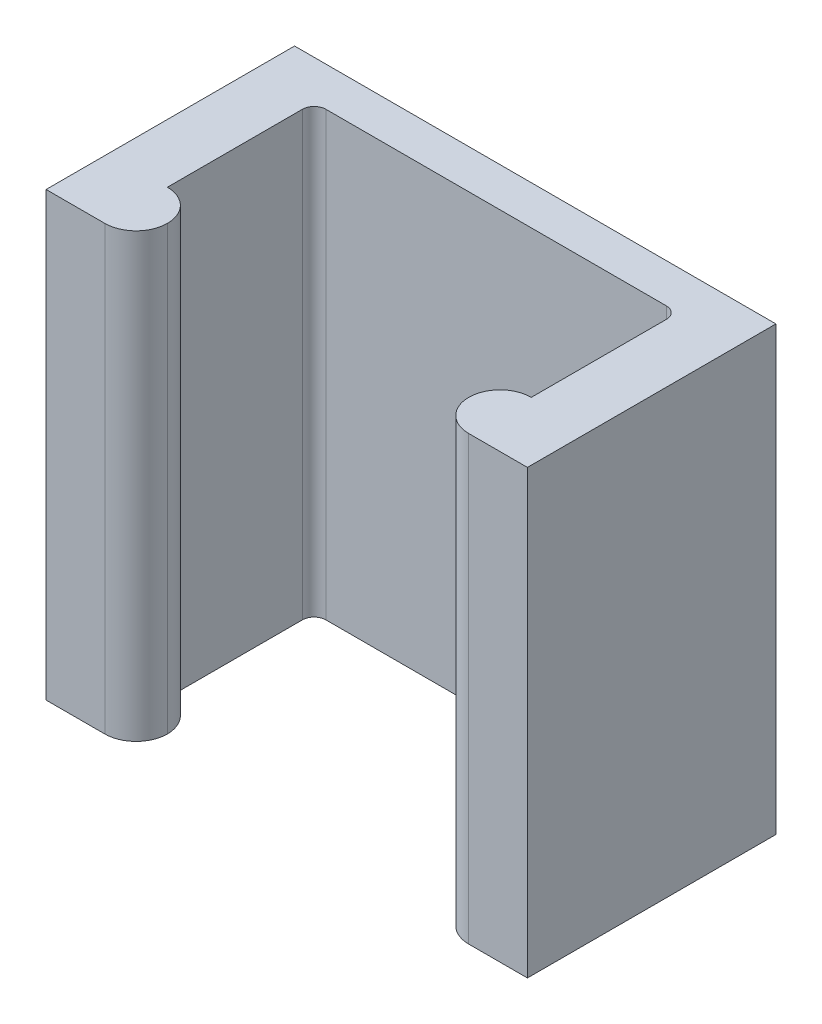
ISO-10303-21;
HEADER;
FILE_DESCRIPTION(('STEP AP214'),'2;1');
FILE_NAME('part.step','',(''),(''),'','','');
FILE_SCHEMA(('AUTOMOTIVE_DESIGN { 1 0 10303 214 1 1 1 1 }'));
ENDSEC;
DATA;
#1=APPLICATION_CONTEXT('core data for automotive mechanical design processes');
#2=APPLICATION_PROTOCOL_DEFINITION('international standard','automotive_design',2000,#1);
#3=PRODUCT_CONTEXT('',#1,'mechanical');
#4=PRODUCT('Part','Part','',(#3));
#5=PRODUCT_RELATED_PRODUCT_CATEGORY('part','',(#4));
#6=PRODUCT_DEFINITION_FORMATION('','',#4);
#7=PRODUCT_DEFINITION_CONTEXT('part definition',#1,'design');
#8=PRODUCT_DEFINITION('design','',#6,#7);
#9=PRODUCT_DEFINITION_SHAPE('','',#8);
#10=(LENGTH_UNIT() NAMED_UNIT(*) SI_UNIT(.MILLI.,.METRE.));
#11=(NAMED_UNIT(*) PLANE_ANGLE_UNIT() SI_UNIT($,.RADIAN.));
#12=(NAMED_UNIT(*) SI_UNIT($,.STERADIAN.) SOLID_ANGLE_UNIT());
#13=UNCERTAINTY_MEASURE_WITH_UNIT(LENGTH_MEASURE(1.E-05),#10,'distance_accuracy_value','');
#14=(GEOMETRIC_REPRESENTATION_CONTEXT(3) GLOBAL_UNCERTAINTY_ASSIGNED_CONTEXT((#13)) GLOBAL_UNIT_ASSIGNED_CONTEXT((#10,
#11,#12)) REPRESENTATION_CONTEXT('',''));
#15=CARTESIAN_POINT('',(0.,0.,0.));
#16=DIRECTION('',(0.,0.,1.));
#17=DIRECTION('',(1.,0.,0.));
#18=AXIS2_PLACEMENT_3D('',#15,#16,#17);
#19=CARTESIAN_POINT('',(4.65,5.65,6.35));
#20=DIRECTION('',(1.,0.,0.));
#21=DIRECTION('',(0.,1.,0.));
#22=AXIS2_PLACEMENT_3D('',#19,#20,#21);
#23=PLANE('',#22);
#24=DIRECTION('',(0.,0.,-1.));
#25=VECTOR('',#24,1.);
#26=CARTESIAN_POINT('',(4.65,5.65,6.35));
#27=LINE('',#26,#25);
#28=CARTESIAN_POINT('',(4.65,5.65,4.75));
#29=VERTEX_POINT('',#28);
#30=CARTESIAN_POINT('',(4.65,5.65,1.3));
#31=VERTEX_POINT('',#30);
#32=EDGE_CURVE('E147',#29,#31,#27,.T.);
#33=ORIENTED_EDGE('',*,*,#32,.T.);
#34=DIRECTION('',(0.,1.,0.));
#35=VECTOR('',#34,1.);
#36=CARTESIAN_POINT('',(4.65,-5.65,1.3));
#37=LINE('',#36,#35);
#38=CARTESIAN_POINT('',(4.65,-5.65,1.3));
#39=VERTEX_POINT('',#38);
#40=EDGE_CURVE('E215',#31,#39,#37,.F.);
#41=ORIENTED_EDGE('',*,*,#40,.T.);
#42=DIRECTION('',(0.,0.,-1.));
#43=VECTOR('',#42,1.);
#44=CARTESIAN_POINT('',(4.65,-5.65,6.35));
#45=LINE('',#44,#43);
#46=CARTESIAN_POINT('',(4.65,-5.65,4.75));
#47=VERTEX_POINT('',#46);
#48=EDGE_CURVE('E150',#47,#39,#45,.T.);
#49=ORIENTED_EDGE('',*,*,#48,.F.);
#50=DIRECTION('',(0.,-1.,0.));
#51=VECTOR('',#50,1.);
#52=CARTESIAN_POINT('',(4.65,-5.65,4.75));
#53=LINE('',#52,#51);
#54=EDGE_CURVE('E145',#29,#47,#53,.T.);
#55=ORIENTED_EDGE('',*,*,#54,.F.);
#56=EDGE_LOOP('',(#33,#41,#49,#55));
#57=FACE_BOUND('',#56,.T.);
#58=ADVANCED_FACE('F42',(#57),#23,.F.);
#59=CARTESIAN_POINT('',(-4.65,5.65,6.35));
#60=DIRECTION('',(-1.,0.,0.));
#61=DIRECTION('',(0.,-1.,0.));
#62=AXIS2_PLACEMENT_3D('',#59,#60,#61);
#63=PLANE('',#62);
#64=DIRECTION('',(0.,0.,-1.));
#65=VECTOR('',#64,1.);
#66=CARTESIAN_POINT('',(-4.65,-5.65,6.35));
#67=LINE('',#66,#65);
#68=CARTESIAN_POINT('',(-4.65,-5.65,4.75));
#69=VERTEX_POINT('',#68);
#70=CARTESIAN_POINT('',(-4.65,-5.65,1.3));
#71=VERTEX_POINT('',#70);
#72=EDGE_CURVE('E327',#69,#71,#67,.T.);
#73=ORIENTED_EDGE('',*,*,#72,.T.);
#74=DIRECTION('',(0.,-1.,0.));
#75=VECTOR('',#74,1.);
#76=CARTESIAN_POINT('',(-4.65,5.65,1.3));
#77=LINE('',#76,#75);
#78=CARTESIAN_POINT('',(-4.65,5.65,1.3));
#79=VERTEX_POINT('',#78);
#80=EDGE_CURVE('E58',#71,#79,#77,.F.);
#81=ORIENTED_EDGE('',*,*,#80,.T.);
#82=DIRECTION('',(0.,0.,-1.));
#83=VECTOR('',#82,1.);
#84=CARTESIAN_POINT('',(-4.65,5.65,6.35));
#85=LINE('',#84,#83);
#86=CARTESIAN_POINT('',(-4.65,5.65,4.75));
#87=VERTEX_POINT('',#86);
#88=EDGE_CURVE('E324',#87,#79,#85,.T.);
#89=ORIENTED_EDGE('',*,*,#88,.F.);
#90=DIRECTION('',(0.,1.,0.));
#91=VECTOR('',#90,1.);
#92=CARTESIAN_POINT('',(-4.65,5.65,4.75));
#93=LINE('',#92,#91);
#94=EDGE_CURVE('E155',#69,#87,#93,.T.);
#95=ORIENTED_EDGE('',*,*,#94,.F.);
#96=EDGE_LOOP('',(#73,#81,#89,#95));
#97=FACE_BOUND('',#96,.T.);
#98=ADVANCED_FACE('F252',(#97),#63,.F.);
#99=CARTESIAN_POINT('',(6.15,-5.65,2.));
#100=DIRECTION('',(-1.,0.,0.));
#101=DIRECTION('',(0.,0.,1.));
#102=AXIS2_PLACEMENT_3D('',#99,#100,#101);
#103=PLANE('',#102);
#104=DIRECTION('',(0.,1.,0.));
#105=VECTOR('',#104,1.);
#106=CARTESIAN_POINT('',(6.15,-5.65,0.));
#107=LINE('',#106,#105);
#108=CARTESIAN_POINT('',(6.15,-5.65,0.));
#109=VERTEX_POINT('',#108);
#110=CARTESIAN_POINT('',(6.15,5.65,0.));
#111=VERTEX_POINT('',#110);
#112=EDGE_CURVE('E330',#109,#111,#107,.T.);
#113=ORIENTED_EDGE('',*,*,#112,.T.);
#114=DIRECTION('',(0.,0.,-1.));
#115=VECTOR('',#114,1.);
#116=CARTESIAN_POINT('',(6.15,5.65,2.));
#117=LINE('',#116,#115);
#118=CARTESIAN_POINT('',(6.15,5.65,6.35));
#119=VERTEX_POINT('',#118);
#120=EDGE_CURVE('E237',#119,#111,#117,.T.);
#121=ORIENTED_EDGE('',*,*,#120,.F.);
#122=DIRECTION('',(0.,1.,0.));
#123=VECTOR('',#122,1.);
#124=CARTESIAN_POINT('',(6.15,5.65,6.35));
#125=LINE('',#124,#123);
#126=CARTESIAN_POINT('',(6.15,-5.65,6.35));
#127=VERTEX_POINT('',#126);
#128=EDGE_CURVE('E299',#127,#119,#125,.T.);
#129=ORIENTED_EDGE('',*,*,#128,.F.);
#130=DIRECTION('',(0.,0.,-1.));
#131=VECTOR('',#130,1.);
#132=CARTESIAN_POINT('',(6.15,-5.65,2.));
#133=LINE('',#132,#131);
#134=EDGE_CURVE('E343',#127,#109,#133,.T.);
#135=ORIENTED_EDGE('',*,*,#134,.T.);
#136=EDGE_LOOP('',(#113,#121,#129,#135));
#137=FACE_BOUND('',#136,.T.);
#138=ADVANCED_FACE('F257',(#137),#103,.F.);
#139=CARTESIAN_POINT('',(-6.15,5.65,2.));
#140=DIRECTION('',(0.,-1.,0.));
#141=DIRECTION('',(0.,0.,-1.));
#142=AXIS2_PLACEMENT_3D('',#139,#140,#141);
#143=PLANE('',#142);
#144=CARTESIAN_POINT('',(4.65,5.65,5.55));
#145=DIRECTION('',(0.,-1.,0.));
#146=DIRECTION('',(0.,0.,-1.));
#147=AXIS2_PLACEMENT_3D('',#144,#145,#146);
#148=CIRCLE('',#147,0.8);
#149=CARTESIAN_POINT('',(3.85,5.65,5.55));
#150=VERTEX_POINT('',#149);
#151=EDGE_CURVE('E160',#29,#150,#148,.F.);
#152=ORIENTED_EDGE('',*,*,#151,.T.);
#153=CARTESIAN_POINT('',(4.65,5.65,5.55));
#154=DIRECTION('',(0.,-1.,0.));
#155=DIRECTION('',(0.,0.,-1.));
#156=AXIS2_PLACEMENT_3D('',#153,#154,#155);
#157=CIRCLE('',#156,0.8);
#158=CARTESIAN_POINT('',(4.65,5.65,6.35));
#159=VERTEX_POINT('',#158);
#160=EDGE_CURVE('E171',#150,#159,#157,.F.);
#161=ORIENTED_EDGE('',*,*,#160,.T.);
#162=DIRECTION('',(-1.,0.,0.));
#163=VECTOR('',#162,1.);
#164=CARTESIAN_POINT('',(6.15,5.65,6.35));
#165=LINE('',#164,#163);
#166=EDGE_CURVE('E305',#119,#159,#165,.T.);
#167=ORIENTED_EDGE('',*,*,#166,.F.);
#168=ORIENTED_EDGE('',*,*,#120,.T.);
#169=DIRECTION('',(-1.,0.,0.));
#170=VECTOR('',#169,1.);
#171=CARTESIAN_POINT('',(-6.15,5.65,0.));
#172=LINE('',#171,#170);
#173=CARTESIAN_POINT('',(-6.15,5.65,0.));
#174=VERTEX_POINT('',#173);
#175=EDGE_CURVE('E334',#111,#174,#172,.T.);
#176=ORIENTED_EDGE('',*,*,#175,.T.);
#177=DIRECTION('',(0.,0.,-1.));
#178=VECTOR('',#177,1.);
#179=CARTESIAN_POINT('',(-6.15,5.65,2.));
#180=LINE('',#179,#178);
#181=CARTESIAN_POINT('',(-6.15,5.65,6.35));
#182=VERTEX_POINT('',#181);
#183=EDGE_CURVE('E351',#182,#174,#180,.T.);
#184=ORIENTED_EDGE('',*,*,#183,.F.);
#185=DIRECTION('',(-1.,0.,0.));
#186=VECTOR('',#185,1.);
#187=CARTESIAN_POINT('',(-6.15,5.65,6.35));
#188=LINE('',#187,#186);
#189=CARTESIAN_POINT('',(-4.65,5.65,6.35));
#190=VERTEX_POINT('',#189);
#191=EDGE_CURVE('E321',#190,#182,#188,.T.);
#192=ORIENTED_EDGE('',*,*,#191,.F.);
#193=CARTESIAN_POINT('',(-4.65,5.65,5.55));
#194=DIRECTION('',(0.,-1.,0.));
#195=DIRECTION('',(0.,0.,-1.));
#196=AXIS2_PLACEMENT_3D('',#193,#194,#195);
#197=CIRCLE('',#196,0.8);
#198=CARTESIAN_POINT('',(-3.85,5.65,5.55));
#199=VERTEX_POINT('',#198);
#200=EDGE_CURVE('E172',#190,#199,#197,.F.);
#201=ORIENTED_EDGE('',*,*,#200,.T.);
#202=CARTESIAN_POINT('',(-4.65,5.65,5.55));
#203=DIRECTION('',(0.,-1.,0.));
#204=DIRECTION('',(0.,0.,-1.));
#205=AXIS2_PLACEMENT_3D('',#202,#203,#204);
#206=CIRCLE('',#205,0.8);
#207=EDGE_CURVE('E178',#199,#87,#206,.F.);
#208=ORIENTED_EDGE('',*,*,#207,.T.);
#209=ORIENTED_EDGE('',*,*,#88,.T.);
#210=CARTESIAN_POINT('',(-4.35,5.65,1.3));
#211=DIRECTION('',(0.,-1.,0.));
#212=DIRECTION('',(0.,0.,-1.));
#213=AXIS2_PLACEMENT_3D('',#210,#211,#212);
#214=CIRCLE('',#213,0.3);
#215=CARTESIAN_POINT('',(-4.35,5.65,1.));
#216=VERTEX_POINT('',#215);
#217=EDGE_CURVE('E11',#79,#216,#214,.T.);
#218=ORIENTED_EDGE('',*,*,#217,.T.);
#219=DIRECTION('',(1.,0.,0.));
#220=VECTOR('',#219,1.);
#221=CARTESIAN_POINT('',(-6.15,5.65,1.));
#222=LINE('',#221,#220);
#223=CARTESIAN_POINT('',(4.35,5.65,1.));
#224=VERTEX_POINT('',#223);
#225=EDGE_CURVE('E296',#216,#224,#222,.T.);
#226=ORIENTED_EDGE('',*,*,#225,.T.);
#227=CARTESIAN_POINT('',(4.35,5.65,1.3));
#228=DIRECTION('',(0.,-1.,0.));
#229=DIRECTION('',(0.,0.,-1.));
#230=AXIS2_PLACEMENT_3D('',#227,#228,#229);
#231=CIRCLE('',#230,0.3);
#232=EDGE_CURVE('E163',#224,#31,#231,.T.);
#233=ORIENTED_EDGE('',*,*,#232,.T.);
#234=ORIENTED_EDGE('',*,*,#32,.F.);
#235=EDGE_LOOP('',(#152,#161,#167,#168,#176,#184,#192,#201,#208,#209,#218,#226,#233,#234));
#236=FACE_BOUND('',#235,.T.);
#237=ADVANCED_FACE('F159',(#236),#143,.F.);
#238=CARTESIAN_POINT('',(-6.15,-5.65,2.));
#239=DIRECTION('',(1.,0.,0.));
#240=DIRECTION('',(0.,0.,-1.));
#241=AXIS2_PLACEMENT_3D('',#238,#239,#240);
#242=PLANE('',#241);
#243=DIRECTION('',(0.,-1.,0.));
#244=VECTOR('',#243,1.);
#245=CARTESIAN_POINT('',(-6.15,-5.65,0.));
#246=LINE('',#245,#244);
#247=CARTESIAN_POINT('',(-6.15,-5.65,0.));
#248=VERTEX_POINT('',#247);
#249=EDGE_CURVE('E337',#174,#248,#246,.T.);
#250=ORIENTED_EDGE('',*,*,#249,.T.);
#251=DIRECTION('',(0.,0.,-1.));
#252=VECTOR('',#251,1.);
#253=CARTESIAN_POINT('',(-6.15,-5.65,2.));
#254=LINE('',#253,#252);
#255=CARTESIAN_POINT('',(-6.15,-5.65,6.35));
#256=VERTEX_POINT('',#255);
#257=EDGE_CURVE('E347',#256,#248,#254,.T.);
#258=ORIENTED_EDGE('',*,*,#257,.F.);
#259=DIRECTION('',(0.,-1.,0.));
#260=VECTOR('',#259,1.);
#261=CARTESIAN_POINT('',(-6.15,5.65,6.35));
#262=LINE('',#261,#260);
#263=EDGE_CURVE('E165',#182,#256,#262,.T.);
#264=ORIENTED_EDGE('',*,*,#263,.F.);
#265=ORIENTED_EDGE('',*,*,#183,.T.);
#266=EDGE_LOOP('',(#250,#258,#264,#265));
#267=FACE_BOUND('',#266,.T.);
#268=ADVANCED_FACE('F273',(#267),#242,.F.);
#269=CARTESIAN_POINT('',(-6.15,-5.65,2.));
#270=DIRECTION('',(0.,1.,0.));
#271=DIRECTION('',(0.,0.,1.));
#272=AXIS2_PLACEMENT_3D('',#269,#270,#271);
#273=PLANE('',#272);
#274=DIRECTION('',(1.,0.,0.));
#275=VECTOR('',#274,1.);
#276=CARTESIAN_POINT('',(6.15,-5.65,6.35));
#277=LINE('',#276,#275);
#278=CARTESIAN_POINT('',(4.65,-5.65,6.35));
#279=VERTEX_POINT('',#278);
#280=EDGE_CURVE('E309',#279,#127,#277,.T.);
#281=ORIENTED_EDGE('',*,*,#280,.F.);
#282=CARTESIAN_POINT('',(4.65,-5.65,5.55));
#283=DIRECTION('',(0.,1.,0.));
#284=DIRECTION('',(0.,0.,1.));
#285=AXIS2_PLACEMENT_3D('',#282,#283,#284);
#286=CIRCLE('',#285,0.8);
#287=CARTESIAN_POINT('',(3.85,-5.65,5.55));
#288=VERTEX_POINT('',#287);
#289=EDGE_CURVE('E194',#279,#288,#286,.F.);
#290=ORIENTED_EDGE('',*,*,#289,.T.);
#291=CARTESIAN_POINT('',(4.65,-5.65,5.55));
#292=DIRECTION('',(0.,1.,0.));
#293=DIRECTION('',(0.,0.,1.));
#294=AXIS2_PLACEMENT_3D('',#291,#292,#293);
#295=CIRCLE('',#294,0.8);
#296=EDGE_CURVE('E191',#288,#47,#295,.F.);
#297=ORIENTED_EDGE('',*,*,#296,.T.);
#298=ORIENTED_EDGE('',*,*,#48,.T.);
#299=CARTESIAN_POINT('',(4.35,-5.65,1.3));
#300=DIRECTION('',(0.,1.,0.));
#301=DIRECTION('',(0.,0.,1.));
#302=AXIS2_PLACEMENT_3D('',#299,#300,#301);
#303=CIRCLE('',#302,0.3);
#304=CARTESIAN_POINT('',(4.35,-5.65,1.));
#305=VERTEX_POINT('',#304);
#306=EDGE_CURVE('E222',#39,#305,#303,.T.);
#307=ORIENTED_EDGE('',*,*,#306,.T.);
#308=DIRECTION('',(-1.,0.,0.));
#309=VECTOR('',#308,1.);
#310=CARTESIAN_POINT('',(-6.15,-5.65,1.));
#311=LINE('',#310,#309);
#312=CARTESIAN_POINT('',(-4.35,-5.65,1.));
#313=VERTEX_POINT('',#312);
#314=EDGE_CURVE('E229',#305,#313,#311,.T.);
#315=ORIENTED_EDGE('',*,*,#314,.T.);
#316=CARTESIAN_POINT('',(-4.35,-5.65,1.3));
#317=DIRECTION('',(0.,1.,0.));
#318=DIRECTION('',(0.,0.,1.));
#319=AXIS2_PLACEMENT_3D('',#316,#317,#318);
#320=CIRCLE('',#319,0.3);
#321=EDGE_CURVE('E51',#313,#71,#320,.T.);
#322=ORIENTED_EDGE('',*,*,#321,.T.);
#323=ORIENTED_EDGE('',*,*,#72,.F.);
#324=CARTESIAN_POINT('',(-4.65,-5.65,5.55));
#325=DIRECTION('',(0.,1.,0.));
#326=DIRECTION('',(0.,0.,1.));
#327=AXIS2_PLACEMENT_3D('',#324,#325,#326);
#328=CIRCLE('',#327,0.8);
#329=CARTESIAN_POINT('',(-3.85,-5.65,5.55));
#330=VERTEX_POINT('',#329);
#331=EDGE_CURVE('E185',#69,#330,#328,.F.);
#332=ORIENTED_EDGE('',*,*,#331,.T.);
#333=CARTESIAN_POINT('',(-4.65,-5.65,5.55));
#334=DIRECTION('',(0.,1.,0.));
#335=DIRECTION('',(0.,0.,1.));
#336=AXIS2_PLACEMENT_3D('',#333,#334,#335);
#337=CIRCLE('',#336,0.8);
#338=CARTESIAN_POINT('',(-4.65,-5.65,6.35));
#339=VERTEX_POINT('',#338);
#340=EDGE_CURVE('E188',#330,#339,#337,.F.);
#341=ORIENTED_EDGE('',*,*,#340,.T.);
#342=DIRECTION('',(1.,0.,0.));
#343=VECTOR('',#342,1.);
#344=CARTESIAN_POINT('',(-6.15,-5.65,6.35));
#345=LINE('',#344,#343);
#346=EDGE_CURVE('E317',#256,#339,#345,.T.);
#347=ORIENTED_EDGE('',*,*,#346,.F.);
#348=ORIENTED_EDGE('',*,*,#257,.T.);
#349=DIRECTION('',(1.,0.,0.));
#350=VECTOR('',#349,1.);
#351=CARTESIAN_POINT('',(-6.15,-5.65,0.));
#352=LINE('',#351,#350);
#353=EDGE_CURVE('E340',#248,#109,#352,.T.);
#354=ORIENTED_EDGE('',*,*,#353,.T.);
#355=ORIENTED_EDGE('',*,*,#134,.F.);
#356=EDGE_LOOP('',(#281,#290,#297,#298,#307,#315,#322,#323,#332,#341,#347,#348,#354,#355));
#357=FACE_BOUND('',#356,.T.);
#358=ADVANCED_FACE('F228',(#357),#273,.F.);
#359=CARTESIAN_POINT('',(0.,0.,0.));
#360=DIRECTION('',(0.,0.,-1.));
#361=DIRECTION('',(-1.,0.,0.));
#362=AXIS2_PLACEMENT_3D('',#359,#360,#361);
#363=PLANE('',#362);
#364=ORIENTED_EDGE('',*,*,#112,.F.);
#365=ORIENTED_EDGE('',*,*,#353,.F.);
#366=ORIENTED_EDGE('',*,*,#249,.F.);
#367=ORIENTED_EDGE('',*,*,#175,.F.);
#368=EDGE_LOOP('',(#364,#365,#366,#367));
#369=FACE_BOUND('',#368,.T.);
#370=ADVANCED_FACE('F265',(#369),#363,.T.);
#371=CARTESIAN_POINT('',(0.,0.,6.35));
#372=DIRECTION('',(0.,0.,1.));
#373=DIRECTION('',(1.,0.,0.));
#374=AXIS2_PLACEMENT_3D('',#371,#372,#373);
#375=PLANE('',#374);
#376=ORIENTED_EDGE('',*,*,#346,.T.);
#377=DIRECTION('',(0.,-1.,0.));
#378=VECTOR('',#377,1.);
#379=CARTESIAN_POINT('',(-4.65,0.,6.35));
#380=LINE('',#379,#378);
#381=EDGE_CURVE('E197',#339,#190,#380,.F.);
#382=ORIENTED_EDGE('',*,*,#381,.T.);
#383=ORIENTED_EDGE('',*,*,#191,.T.);
#384=ORIENTED_EDGE('',*,*,#263,.T.);
#385=EDGE_LOOP('',(#376,#382,#383,#384));
#386=FACE_BOUND('',#385,.T.);
#387=ADVANCED_FACE('F263',(#386),#375,.T.);
#388=CARTESIAN_POINT('',(0.,0.,6.35));
#389=DIRECTION('',(0.,0.,-1.));
#390=DIRECTION('',(-1.,0.,0.));
#391=AXIS2_PLACEMENT_3D('',#388,#389,#390);
#392=PLANE('',#391);
#393=ORIENTED_EDGE('',*,*,#166,.T.);
#394=DIRECTION('',(0.,1.,0.));
#395=VECTOR('',#394,1.);
#396=CARTESIAN_POINT('',(4.65,-5.65,6.35));
#397=LINE('',#396,#395);
#398=EDGE_CURVE('E176',#159,#279,#397,.F.);
#399=ORIENTED_EDGE('',*,*,#398,.T.);
#400=ORIENTED_EDGE('',*,*,#280,.T.);
#401=ORIENTED_EDGE('',*,*,#128,.T.);
#402=EDGE_LOOP('',(#393,#399,#400,#401));
#403=FACE_BOUND('',#402,.T.);
#404=ADVANCED_FACE('F261',(#403),#392,.F.);
#405=CARTESIAN_POINT('',(0.,0.,1.));
#406=DIRECTION('',(0.,0.,-1.));
#407=DIRECTION('',(-1.,0.,0.));
#408=AXIS2_PLACEMENT_3D('',#405,#406,#407);
#409=PLANE('',#408);
#410=ORIENTED_EDGE('',*,*,#314,.F.);
#411=DIRECTION('',(0.,1.,0.));
#412=VECTOR('',#411,1.);
#413=CARTESIAN_POINT('',(4.35,5.65,1.));
#414=LINE('',#413,#412);
#415=EDGE_CURVE('E211',#305,#224,#414,.T.);
#416=ORIENTED_EDGE('',*,*,#415,.T.);
#417=ORIENTED_EDGE('',*,*,#225,.F.);
#418=DIRECTION('',(0.,-1.,0.));
#419=VECTOR('',#418,1.);
#420=CARTESIAN_POINT('',(-4.35,-5.65,1.));
#421=LINE('',#420,#419);
#422=EDGE_CURVE('E201',#216,#313,#421,.T.);
#423=ORIENTED_EDGE('',*,*,#422,.T.);
#424=EDGE_LOOP('',(#410,#416,#417,#423));
#425=FACE_BOUND('',#424,.T.);
#426=ADVANCED_FACE('F233',(#425),#409,.F.);
#427=CARTESIAN_POINT('',(4.65,0.,5.55));
#428=DIRECTION('',(0.,1.,0.));
#429=DIRECTION('',(-1.,0.,0.));
#430=AXIS2_PLACEMENT_3D('',#427,#428,#429);
#431=CYLINDRICAL_SURFACE('',#430,0.8);
#432=ORIENTED_EDGE('',*,*,#54,.T.);
#433=ORIENTED_EDGE('',*,*,#296,.F.);
#434=DIRECTION('',(0.,-1.,0.));
#435=VECTOR('',#434,1.);
#436=CARTESIAN_POINT('',(3.85,-5.65,5.55));
#437=LINE('',#436,#435);
#438=EDGE_CURVE('E156',#150,#288,#437,.T.);
#439=ORIENTED_EDGE('',*,*,#438,.F.);
#440=ORIENTED_EDGE('',*,*,#151,.F.);
#441=EDGE_LOOP('',(#432,#433,#439,#440));
#442=FACE_BOUND('',#441,.T.);
#443=ADVANCED_FACE('F167',(#442),#431,.T.);
#444=CARTESIAN_POINT('',(4.65,0.,5.55));
#445=DIRECTION('',(0.,-1.,0.));
#446=DIRECTION('',(1.,0.,0.));
#447=AXIS2_PLACEMENT_3D('',#444,#445,#446);
#448=CYLINDRICAL_SURFACE('',#447,0.8);
#449=ORIENTED_EDGE('',*,*,#289,.F.);
#450=ORIENTED_EDGE('',*,*,#398,.F.);
#451=ORIENTED_EDGE('',*,*,#160,.F.);
#452=ORIENTED_EDGE('',*,*,#438,.T.);
#453=EDGE_LOOP('',(#449,#450,#451,#452));
#454=FACE_BOUND('',#453,.T.);
#455=ADVANCED_FACE('F282',(#454),#448,.T.);
#456=CARTESIAN_POINT('',(-4.65,0.,5.55));
#457=DIRECTION('',(0.,-1.,0.));
#458=DIRECTION('',(1.,0.,0.));
#459=AXIS2_PLACEMENT_3D('',#456,#457,#458);
#460=CYLINDRICAL_SURFACE('',#459,0.8);
#461=ORIENTED_EDGE('',*,*,#94,.T.);
#462=ORIENTED_EDGE('',*,*,#207,.F.);
#463=DIRECTION('',(0.,1.,0.));
#464=VECTOR('',#463,1.);
#465=CARTESIAN_POINT('',(-3.85,5.65,5.55));
#466=LINE('',#465,#464);
#467=EDGE_CURVE('E204',#330,#199,#466,.T.);
#468=ORIENTED_EDGE('',*,*,#467,.F.);
#469=ORIENTED_EDGE('',*,*,#331,.F.);
#470=EDGE_LOOP('',(#461,#462,#468,#469));
#471=FACE_BOUND('',#470,.T.);
#472=ADVANCED_FACE('F247',(#471),#460,.T.);
#473=CARTESIAN_POINT('',(-4.65,0.,5.55));
#474=DIRECTION('',(0.,-1.,0.));
#475=DIRECTION('',(1.,0.,0.));
#476=AXIS2_PLACEMENT_3D('',#473,#474,#475);
#477=CYLINDRICAL_SURFACE('',#476,0.8);
#478=ORIENTED_EDGE('',*,*,#200,.F.);
#479=ORIENTED_EDGE('',*,*,#381,.F.);
#480=ORIENTED_EDGE('',*,*,#340,.F.);
#481=ORIENTED_EDGE('',*,*,#467,.T.);
#482=EDGE_LOOP('',(#478,#479,#480,#481));
#483=FACE_BOUND('',#482,.T.);
#484=ADVANCED_FACE('F241',(#483),#477,.T.);
#485=CARTESIAN_POINT('',(4.35,0.,1.3));
#486=DIRECTION('',(0.,-1.,0.));
#487=DIRECTION('',(1.,0.,0.));
#488=AXIS2_PLACEMENT_3D('',#485,#486,#487);
#489=CYLINDRICAL_SURFACE('',#488,0.3);
#490=ORIENTED_EDGE('',*,*,#306,.F.);
#491=ORIENTED_EDGE('',*,*,#40,.F.);
#492=ORIENTED_EDGE('',*,*,#232,.F.);
#493=ORIENTED_EDGE('',*,*,#415,.F.);
#494=EDGE_LOOP('',(#490,#491,#492,#493));
#495=FACE_BOUND('',#494,.T.);
#496=ADVANCED_FACE('F239',(#495),#489,.F.);
#497=CARTESIAN_POINT('',(-4.35,0.,1.3));
#498=DIRECTION('',(0.,1.,0.));
#499=DIRECTION('',(-1.,0.,0.));
#500=AXIS2_PLACEMENT_3D('',#497,#498,#499);
#501=CYLINDRICAL_SURFACE('',#500,0.3);
#502=ORIENTED_EDGE('',*,*,#217,.F.);
#503=ORIENTED_EDGE('',*,*,#80,.F.);
#504=ORIENTED_EDGE('',*,*,#321,.F.);
#505=ORIENTED_EDGE('',*,*,#422,.F.);
#506=EDGE_LOOP('',(#502,#503,#504,#505));
#507=FACE_BOUND('',#506,.T.);
#508=ADVANCED_FACE('F44',(#507),#501,.F.);
#509=CLOSED_SHELL('',(#58,#98,#138,#237,#268,#358,#370,#387,#404,#426,#443,#455,#472,#484,#496,#508));
#510=MANIFOLD_SOLID_BREP('B2',#509);
#511=ADVANCED_BREP_SHAPE_REPRESENTATION('',(#18,#510),#14);
#512=SHAPE_DEFINITION_REPRESENTATION(#9,#511);
ENDSEC;
END-ISO-10303-21;
